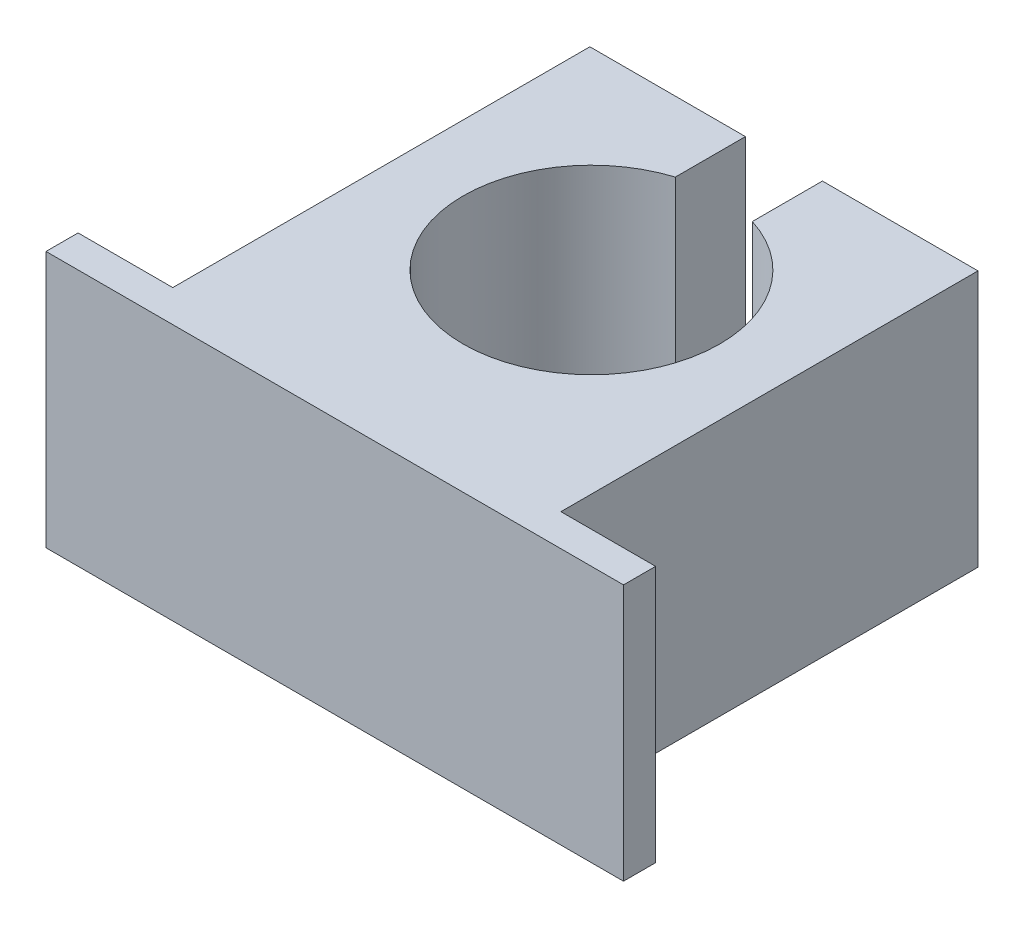
ISO-10303-21;
HEADER;
FILE_DESCRIPTION(('STEP AP214'),'2;1');
FILE_NAME('part.step','',(''),(''),'','','');
FILE_SCHEMA(('AUTOMOTIVE_DESIGN { 1 0 10303 214 1 1 1 1 }'));
ENDSEC;
DATA;
#1=APPLICATION_CONTEXT('core data for automotive mechanical design processes');
#2=APPLICATION_PROTOCOL_DEFINITION('international standard','automotive_design',2000,#1);
#3=PRODUCT_CONTEXT('',#1,'mechanical');
#4=PRODUCT('Part','Part','',(#3));
#5=PRODUCT_RELATED_PRODUCT_CATEGORY('part','',(#4));
#6=PRODUCT_DEFINITION_FORMATION('','',#4);
#7=PRODUCT_DEFINITION_CONTEXT('part definition',#1,'design');
#8=PRODUCT_DEFINITION('design','',#6,#7);
#9=PRODUCT_DEFINITION_SHAPE('','',#8);
#10=(LENGTH_UNIT() NAMED_UNIT(*) SI_UNIT(.MILLI.,.METRE.));
#11=(NAMED_UNIT(*) PLANE_ANGLE_UNIT() SI_UNIT($,.RADIAN.));
#12=(NAMED_UNIT(*) SI_UNIT($,.STERADIAN.) SOLID_ANGLE_UNIT());
#13=UNCERTAINTY_MEASURE_WITH_UNIT(LENGTH_MEASURE(1.E-05),#10,'distance_accuracy_value','');
#14=(GEOMETRIC_REPRESENTATION_CONTEXT(3) GLOBAL_UNCERTAINTY_ASSIGNED_CONTEXT((#13)) GLOBAL_UNIT_ASSIGNED_CONTEXT((#10,
#11,#12)) REPRESENTATION_CONTEXT('',''));
#15=CARTESIAN_POINT('',(0.,0.,0.));
#16=DIRECTION('',(0.,0.,1.));
#17=DIRECTION('',(1.,0.,0.));
#18=AXIS2_PLACEMENT_3D('',#15,#16,#17);
#19=CARTESIAN_POINT('',(-45.,40.,-35.));
#20=DIRECTION('',(0.,0.,1.));
#21=DIRECTION('',(1.,0.,0.));
#22=AXIS2_PLACEMENT_3D('',#19,#20,#21);
#23=PLANE('',#22);
#24=DIRECTION('',(-1.,0.,0.));
#25=VECTOR('',#24,1.);
#26=CARTESIAN_POINT('',(-45.,0.,-35.));
#27=LINE('',#26,#25);
#28=CARTESIAN_POINT('',(30.2446487914628,0.,-35.));
#29=VERTEX_POINT('',#28);
#30=CARTESIAN_POINT('',(6.,0.,-35.));
#31=VERTEX_POINT('',#30);
#32=EDGE_CURVE('E176',#29,#31,#27,.T.);
#33=ORIENTED_EDGE('',*,*,#32,.T.);
#34=DIRECTION('',(0.,1.,0.));
#35=VECTOR('',#34,1.);
#36=CARTESIAN_POINT('',(6.,40.,-35.));
#37=LINE('',#36,#35);
#38=CARTESIAN_POINT('',(6.,40.,-35.));
#39=VERTEX_POINT('',#38);
#40=EDGE_CURVE('E247',#31,#39,#37,.T.);
#41=ORIENTED_EDGE('',*,*,#40,.T.);
#42=DIRECTION('',(-1.,0.,0.));
#43=VECTOR('',#42,1.);
#44=CARTESIAN_POINT('',(-45.,40.,-35.));
#45=LINE('',#44,#43);
#46=CARTESIAN_POINT('',(30.2446487914628,40.,-35.));
#47=VERTEX_POINT('',#46);
#48=EDGE_CURVE('E140',#47,#39,#45,.T.);
#49=ORIENTED_EDGE('',*,*,#48,.F.);
#50=DIRECTION('',(0.,1.,0.));
#51=VECTOR('',#50,1.);
#52=CARTESIAN_POINT('',(30.2446487914628,0.,-35.));
#53=LINE('',#52,#51);
#54=EDGE_CURVE('E242',#29,#47,#53,.T.);
#55=ORIENTED_EDGE('',*,*,#54,.F.);
#56=EDGE_LOOP('',(#33,#41,#49,#55));
#57=FACE_BOUND('',#56,.T.);
#58=ADVANCED_FACE('F39',(#57),#23,.F.);
#59=CARTESIAN_POINT('',(45.,40.,-35.));
#60=DIRECTION('',(-1.,0.,0.));
#61=DIRECTION('',(0.,0.,1.));
#62=AXIS2_PLACEMENT_3D('',#59,#60,#61);
#63=PLANE('',#62);
#64=DIRECTION('',(0.,0.,-1.));
#65=VECTOR('',#64,1.);
#66=CARTESIAN_POINT('',(45.,0.,-35.));
#67=LINE('',#66,#65);
#68=CARTESIAN_POINT('',(45.,0.,35.));
#69=VERTEX_POINT('',#68);
#70=CARTESIAN_POINT('',(45.,0.,30.));
#71=VERTEX_POINT('',#70);
#72=EDGE_CURVE('E150',#69,#71,#67,.T.);
#73=ORIENTED_EDGE('',*,*,#72,.T.);
#74=DIRECTION('',(0.,1.,0.));
#75=VECTOR('',#74,1.);
#76=CARTESIAN_POINT('',(45.,0.,30.));
#77=LINE('',#76,#75);
#78=CARTESIAN_POINT('',(45.,40.,30.));
#79=VERTEX_POINT('',#78);
#80=EDGE_CURVE('E228',#71,#79,#77,.T.);
#81=ORIENTED_EDGE('',*,*,#80,.T.);
#82=DIRECTION('',(0.,0.,-1.));
#83=VECTOR('',#82,1.);
#84=CARTESIAN_POINT('',(45.,40.,-35.));
#85=LINE('',#84,#83);
#86=CARTESIAN_POINT('',(45.,40.,35.));
#87=VERTEX_POINT('',#86);
#88=EDGE_CURVE('E157',#87,#79,#85,.T.);
#89=ORIENTED_EDGE('',*,*,#88,.F.);
#90=DIRECTION('',(0.,-1.,0.));
#91=VECTOR('',#90,1.);
#92=CARTESIAN_POINT('',(45.,40.,35.));
#93=LINE('',#92,#91);
#94=EDGE_CURVE('E171',#87,#69,#93,.T.);
#95=ORIENTED_EDGE('',*,*,#94,.T.);
#96=EDGE_LOOP('',(#73,#81,#89,#95));
#97=FACE_BOUND('',#96,.T.);
#98=ADVANCED_FACE('F41',(#97),#63,.F.);
#99=CARTESIAN_POINT('',(-6.,40.,-35.));
#100=VERTEX_POINT('',#99);
#101=CARTESIAN_POINT('',(-30.2446487914628,40.,-35.));
#102=VERTEX_POINT('',#101);
#103=EDGE_CURVE('E161',#100,#102,#45,.T.);
#104=ORIENTED_EDGE('',*,*,#103,.F.);
#105=DIRECTION('',(0.,-1.,0.));
#106=VECTOR('',#105,1.);
#107=CARTESIAN_POINT('',(-6.,40.,-35.));
#108=LINE('',#107,#106);
#109=CARTESIAN_POINT('',(-6.,0.,-35.));
#110=VERTEX_POINT('',#109);
#111=EDGE_CURVE('E200',#100,#110,#108,.T.);
#112=ORIENTED_EDGE('',*,*,#111,.T.);
#113=CARTESIAN_POINT('',(-30.2446487914628,0.,-35.));
#114=VERTEX_POINT('',#113);
#115=EDGE_CURVE('E175',#110,#114,#27,.T.);
#116=ORIENTED_EDGE('',*,*,#115,.T.);
#117=DIRECTION('',(0.,1.,0.));
#118=VECTOR('',#117,1.);
#119=CARTESIAN_POINT('',(-30.2446487914628,0.,-35.));
#120=LINE('',#119,#118);
#121=EDGE_CURVE('E146',#114,#102,#120,.T.);
#122=ORIENTED_EDGE('',*,*,#121,.T.);
#123=EDGE_LOOP('',(#104,#112,#116,#122));
#124=FACE_BOUND('',#123,.T.);
#125=ADVANCED_FACE('F199',(#124),#23,.F.);
#126=CARTESIAN_POINT('',(-45.,40.,-35.));
#127=DIRECTION('',(1.,0.,0.));
#128=DIRECTION('',(0.,0.,-1.));
#129=AXIS2_PLACEMENT_3D('',#126,#127,#128);
#130=PLANE('',#129);
#131=DIRECTION('',(0.,0.,1.));
#132=VECTOR('',#131,1.);
#133=CARTESIAN_POINT('',(-45.,40.,-35.));
#134=LINE('',#133,#132);
#135=CARTESIAN_POINT('',(-45.,40.,30.));
#136=VERTEX_POINT('',#135);
#137=CARTESIAN_POINT('',(-45.,40.,35.));
#138=VERTEX_POINT('',#137);
#139=EDGE_CURVE('E165',#136,#138,#134,.T.);
#140=ORIENTED_EDGE('',*,*,#139,.F.);
#141=DIRECTION('',(0.,1.,0.));
#142=VECTOR('',#141,1.);
#143=CARTESIAN_POINT('',(-45.,0.,30.));
#144=LINE('',#143,#142);
#145=CARTESIAN_POINT('',(-45.,0.,30.));
#146=VERTEX_POINT('',#145);
#147=EDGE_CURVE('E216',#146,#136,#144,.T.);
#148=ORIENTED_EDGE('',*,*,#147,.F.);
#149=DIRECTION('',(0.,0.,1.));
#150=VECTOR('',#149,1.);
#151=CARTESIAN_POINT('',(-45.,0.,-35.));
#152=LINE('',#151,#150);
#153=CARTESIAN_POINT('',(-45.,0.,35.));
#154=VERTEX_POINT('',#153);
#155=EDGE_CURVE('E180',#146,#154,#152,.T.);
#156=ORIENTED_EDGE('',*,*,#155,.T.);
#157=DIRECTION('',(0.,-1.,0.));
#158=VECTOR('',#157,1.);
#159=CARTESIAN_POINT('',(-45.,40.,35.));
#160=LINE('',#159,#158);
#161=EDGE_CURVE('E188',#138,#154,#160,.T.);
#162=ORIENTED_EDGE('',*,*,#161,.F.);
#163=EDGE_LOOP('',(#140,#148,#156,#162));
#164=FACE_BOUND('',#163,.T.);
#165=ADVANCED_FACE('F280',(#164),#130,.F.);
#166=CARTESIAN_POINT('',(-45.,40.,35.));
#167=DIRECTION('',(0.,0.,-1.));
#168=DIRECTION('',(-1.,0.,0.));
#169=AXIS2_PLACEMENT_3D('',#166,#167,#168);
#170=PLANE('',#169);
#171=DIRECTION('',(1.,0.,0.));
#172=VECTOR('',#171,1.);
#173=CARTESIAN_POINT('',(-45.,0.,35.));
#174=LINE('',#173,#172);
#175=EDGE_CURVE('E162',#154,#69,#174,.T.);
#176=ORIENTED_EDGE('',*,*,#175,.T.);
#177=ORIENTED_EDGE('',*,*,#94,.F.);
#178=DIRECTION('',(1.,0.,0.));
#179=VECTOR('',#178,1.);
#180=CARTESIAN_POINT('',(-45.,40.,35.));
#181=LINE('',#180,#179);
#182=EDGE_CURVE('E168',#138,#87,#181,.T.);
#183=ORIENTED_EDGE('',*,*,#182,.F.);
#184=ORIENTED_EDGE('',*,*,#161,.T.);
#185=EDGE_LOOP('',(#176,#177,#183,#184));
#186=FACE_BOUND('',#185,.T.);
#187=ADVANCED_FACE('F285',(#186),#170,.F.);
#188=CARTESIAN_POINT('',(0.,40.,0.));
#189=DIRECTION('',(0.,1.,0.));
#190=DIRECTION('',(0.,0.,1.));
#191=AXIS2_PLACEMENT_3D('',#188,#189,#190);
#192=PLANE('',#191);
#193=DIRECTION('',(0.,0.,-1.));
#194=VECTOR('',#193,1.);
#195=CARTESIAN_POINT('',(6.,40.,-48.5116266802438));
#196=LINE('',#195,#194);
#197=CARTESIAN_POINT('',(6.,40.,-24.0787840283389));
#198=VERTEX_POINT('',#197);
#199=EDGE_CURVE('E127',#198,#39,#196,.T.);
#200=ORIENTED_EDGE('',*,*,#199,.F.);
#201=CARTESIAN_POINT('',(0.,40.,-5.));
#202=DIRECTION('',(0.,1.,0.));
#203=DIRECTION('',(0.,0.,1.));
#204=AXIS2_PLACEMENT_3D('',#201,#202,#203);
#205=CIRCLE('',#204,20.);
#206=CARTESIAN_POINT('',(-6.,40.,-24.0787840283389));
#207=VERTEX_POINT('',#206);
#208=EDGE_CURVE('E137',#207,#198,#205,.T.);
#209=ORIENTED_EDGE('',*,*,#208,.F.);
#210=DIRECTION('',(0.,0.,1.));
#211=VECTOR('',#210,1.);
#212=CARTESIAN_POINT('',(-6.,40.,-48.5116266802438));
#213=LINE('',#212,#211);
#214=EDGE_CURVE('E55',#100,#207,#213,.T.);
#215=ORIENTED_EDGE('',*,*,#214,.F.);
#216=ORIENTED_EDGE('',*,*,#103,.T.);
#217=DIRECTION('',(0.,0.,-1.));
#218=VECTOR('',#217,1.);
#219=CARTESIAN_POINT('',(-30.2446487914628,40.,-35.));
#220=LINE('',#219,#218);
#221=CARTESIAN_POINT('',(-30.2446487914628,40.,30.));
#222=VERTEX_POINT('',#221);
#223=EDGE_CURVE('E210',#222,#102,#220,.T.);
#224=ORIENTED_EDGE('',*,*,#223,.F.);
#225=DIRECTION('',(1.,0.,0.));
#226=VECTOR('',#225,1.);
#227=CARTESIAN_POINT('',(-45.,40.,30.));
#228=LINE('',#227,#226);
#229=EDGE_CURVE('E224',#136,#222,#228,.T.);
#230=ORIENTED_EDGE('',*,*,#229,.F.);
#231=ORIENTED_EDGE('',*,*,#139,.T.);
#232=ORIENTED_EDGE('',*,*,#182,.T.);
#233=ORIENTED_EDGE('',*,*,#88,.T.);
#234=DIRECTION('',(1.,0.,0.));
#235=VECTOR('',#234,1.);
#236=CARTESIAN_POINT('',(45.,40.,30.));
#237=LINE('',#236,#235);
#238=CARTESIAN_POINT('',(30.2446487914628,40.,30.));
#239=VERTEX_POINT('',#238);
#240=EDGE_CURVE('E238',#239,#79,#237,.T.);
#241=ORIENTED_EDGE('',*,*,#240,.F.);
#242=DIRECTION('',(0.,0.,1.));
#243=VECTOR('',#242,1.);
#244=CARTESIAN_POINT('',(30.2446487914628,40.,-35.));
#245=LINE('',#244,#243);
#246=EDGE_CURVE('E243',#47,#239,#245,.T.);
#247=ORIENTED_EDGE('',*,*,#246,.F.);
#248=ORIENTED_EDGE('',*,*,#48,.T.);
#249=EDGE_LOOP('',(#200,#209,#215,#216,#224,#230,#231,#232,#233,#241,#247,#248));
#250=FACE_BOUND('',#249,.T.);
#251=ADVANCED_FACE('F136',(#250),#192,.T.);
#252=CARTESIAN_POINT('',(0.,0.,0.));
#253=DIRECTION('',(0.,1.,0.));
#254=DIRECTION('',(0.,0.,1.));
#255=AXIS2_PLACEMENT_3D('',#252,#253,#254);
#256=PLANE('',#255);
#257=CARTESIAN_POINT('',(0.,0.,-5.));
#258=DIRECTION('',(0.,1.,0.));
#259=DIRECTION('',(0.,0.,1.));
#260=AXIS2_PLACEMENT_3D('',#257,#258,#259);
#261=CIRCLE('',#260,20.);
#262=CARTESIAN_POINT('',(-6.,0.,-24.0787840283389));
#263=VERTEX_POINT('',#262);
#264=CARTESIAN_POINT('',(6.,0.,-24.0787840283389));
#265=VERTEX_POINT('',#264);
#266=EDGE_CURVE('E145',#263,#265,#261,.T.);
#267=ORIENTED_EDGE('',*,*,#266,.T.);
#268=DIRECTION('',(0.,0.,-1.));
#269=VECTOR('',#268,1.);
#270=CARTESIAN_POINT('',(6.,0.,-48.5116266802438));
#271=LINE('',#270,#269);
#272=EDGE_CURVE('E63',#265,#31,#271,.T.);
#273=ORIENTED_EDGE('',*,*,#272,.T.);
#274=ORIENTED_EDGE('',*,*,#32,.F.);
#275=DIRECTION('',(0.,0.,1.));
#276=VECTOR('',#275,1.);
#277=CARTESIAN_POINT('',(30.2446487914628,0.,-35.));
#278=LINE('',#277,#276);
#279=CARTESIAN_POINT('',(30.2446487914628,0.,30.));
#280=VERTEX_POINT('',#279);
#281=EDGE_CURVE('E233',#29,#280,#278,.T.);
#282=ORIENTED_EDGE('',*,*,#281,.T.);
#283=DIRECTION('',(1.,0.,0.));
#284=VECTOR('',#283,1.);
#285=CARTESIAN_POINT('',(45.,0.,30.));
#286=LINE('',#285,#284);
#287=EDGE_CURVE('E237',#280,#71,#286,.T.);
#288=ORIENTED_EDGE('',*,*,#287,.T.);
#289=ORIENTED_EDGE('',*,*,#72,.F.);
#290=ORIENTED_EDGE('',*,*,#175,.F.);
#291=ORIENTED_EDGE('',*,*,#155,.F.);
#292=DIRECTION('',(1.,0.,0.));
#293=VECTOR('',#292,1.);
#294=CARTESIAN_POINT('',(-45.,0.,30.));
#295=LINE('',#294,#293);
#296=CARTESIAN_POINT('',(-30.2446487914628,0.,30.));
#297=VERTEX_POINT('',#296);
#298=EDGE_CURVE('E214',#146,#297,#295,.T.);
#299=ORIENTED_EDGE('',*,*,#298,.T.);
#300=DIRECTION('',(0.,0.,-1.));
#301=VECTOR('',#300,1.);
#302=CARTESIAN_POINT('',(-30.2446487914628,0.,-35.));
#303=LINE('',#302,#301);
#304=EDGE_CURVE('E207',#297,#114,#303,.T.);
#305=ORIENTED_EDGE('',*,*,#304,.T.);
#306=ORIENTED_EDGE('',*,*,#115,.F.);
#307=DIRECTION('',(0.,0.,1.));
#308=VECTOR('',#307,1.);
#309=CARTESIAN_POINT('',(-6.,0.,-48.5116266802438));
#310=LINE('',#309,#308);
#311=EDGE_CURVE('E265',#110,#263,#310,.T.);
#312=ORIENTED_EDGE('',*,*,#311,.T.);
#313=EDGE_LOOP('',(#267,#273,#274,#282,#288,#289,#290,#291,#299,#305,#306,#312));
#314=FACE_BOUND('',#313,.T.);
#315=ADVANCED_FACE('F212',(#314),#256,.F.);
#316=CARTESIAN_POINT('',(0.,0.,-5.));
#317=DIRECTION('',(0.,1.,0.));
#318=DIRECTION('',(0.,0.,1.));
#319=AXIS2_PLACEMENT_3D('',#316,#317,#318);
#320=CYLINDRICAL_SURFACE('',#319,20.);
#321=ORIENTED_EDGE('',*,*,#208,.T.);
#322=DIRECTION('',(0.,1.,0.));
#323=VECTOR('',#322,1.);
#324=CARTESIAN_POINT('',(6.,0.,-24.0787840283389));
#325=LINE('',#324,#323);
#326=EDGE_CURVE('E11',#198,#265,#325,.F.);
#327=ORIENTED_EDGE('',*,*,#326,.T.);
#328=ORIENTED_EDGE('',*,*,#266,.F.);
#329=DIRECTION('',(0.,1.,0.));
#330=VECTOR('',#329,1.);
#331=CARTESIAN_POINT('',(-6.,0.,-24.0787840283389));
#332=LINE('',#331,#330);
#333=EDGE_CURVE('E48',#263,#207,#332,.T.);
#334=ORIENTED_EDGE('',*,*,#333,.T.);
#335=EDGE_LOOP('',(#321,#327,#328,#334));
#336=FACE_BOUND('',#335,.T.);
#337=ADVANCED_FACE('F143',(#336),#320,.F.);
#338=CARTESIAN_POINT('',(45.,0.,30.));
#339=DIRECTION('',(0.,0.,1.));
#340=DIRECTION('',(1.,0.,0.));
#341=AXIS2_PLACEMENT_3D('',#338,#339,#340);
#342=PLANE('',#341);
#343=ORIENTED_EDGE('',*,*,#240,.T.);
#344=ORIENTED_EDGE('',*,*,#80,.F.);
#345=ORIENTED_EDGE('',*,*,#287,.F.);
#346=DIRECTION('',(0.,1.,0.));
#347=VECTOR('',#346,1.);
#348=CARTESIAN_POINT('',(30.2446487914628,0.,30.));
#349=LINE('',#348,#347);
#350=EDGE_CURVE('E253',#280,#239,#349,.T.);
#351=ORIENTED_EDGE('',*,*,#350,.T.);
#352=EDGE_LOOP('',(#343,#344,#345,#351));
#353=FACE_BOUND('',#352,.T.);
#354=ADVANCED_FACE('F290',(#353),#342,.F.);
#355=CARTESIAN_POINT('',(30.2446487914628,0.,-35.));
#356=DIRECTION('',(-1.,0.,0.));
#357=DIRECTION('',(0.,0.,1.));
#358=AXIS2_PLACEMENT_3D('',#355,#356,#357);
#359=PLANE('',#358);
#360=ORIENTED_EDGE('',*,*,#246,.T.);
#361=ORIENTED_EDGE('',*,*,#350,.F.);
#362=ORIENTED_EDGE('',*,*,#281,.F.);
#363=ORIENTED_EDGE('',*,*,#54,.T.);
#364=EDGE_LOOP('',(#360,#361,#362,#363));
#365=FACE_BOUND('',#364,.T.);
#366=ADVANCED_FACE('F258',(#365),#359,.F.);
#367=CARTESIAN_POINT('',(-30.2446487914628,0.,-35.));
#368=DIRECTION('',(1.,0.,0.));
#369=DIRECTION('',(0.,0.,-1.));
#370=AXIS2_PLACEMENT_3D('',#367,#368,#369);
#371=PLANE('',#370);
#372=ORIENTED_EDGE('',*,*,#223,.T.);
#373=ORIENTED_EDGE('',*,*,#121,.F.);
#374=ORIENTED_EDGE('',*,*,#304,.F.);
#375=DIRECTION('',(0.,1.,0.));
#376=VECTOR('',#375,1.);
#377=CARTESIAN_POINT('',(-30.2446487914628,0.,30.));
#378=LINE('',#377,#376);
#379=EDGE_CURVE('E153',#297,#222,#378,.T.);
#380=ORIENTED_EDGE('',*,*,#379,.T.);
#381=EDGE_LOOP('',(#372,#373,#374,#380));
#382=FACE_BOUND('',#381,.T.);
#383=ADVANCED_FACE('F206',(#382),#371,.F.);
#384=CARTESIAN_POINT('',(-45.,0.,30.));
#385=DIRECTION('',(0.,0.,1.));
#386=DIRECTION('',(1.,0.,0.));
#387=AXIS2_PLACEMENT_3D('',#384,#385,#386);
#388=PLANE('',#387);
#389=ORIENTED_EDGE('',*,*,#229,.T.);
#390=ORIENTED_EDGE('',*,*,#379,.F.);
#391=ORIENTED_EDGE('',*,*,#298,.F.);
#392=ORIENTED_EDGE('',*,*,#147,.T.);
#393=EDGE_LOOP('',(#389,#390,#391,#392));
#394=FACE_BOUND('',#393,.T.);
#395=ADVANCED_FACE('F339',(#394),#388,.F.);
#396=CARTESIAN_POINT('',(-6.,0.,-48.5116266802438));
#397=DIRECTION('',(-1.,0.,0.));
#398=DIRECTION('',(0.,0.,1.));
#399=AXIS2_PLACEMENT_3D('',#396,#397,#398);
#400=PLANE('',#399);
#401=ORIENTED_EDGE('',*,*,#214,.T.);
#402=ORIENTED_EDGE('',*,*,#333,.F.);
#403=ORIENTED_EDGE('',*,*,#311,.F.);
#404=ORIENTED_EDGE('',*,*,#111,.F.);
#405=EDGE_LOOP('',(#401,#402,#403,#404));
#406=FACE_BOUND('',#405,.T.);
#407=ADVANCED_FACE('F273',(#406),#400,.F.);
#408=CARTESIAN_POINT('',(6.,0.,-48.5116266802438));
#409=DIRECTION('',(1.,0.,0.));
#410=DIRECTION('',(0.,0.,-1.));
#411=AXIS2_PLACEMENT_3D('',#408,#409,#410);
#412=PLANE('',#411);
#413=ORIENTED_EDGE('',*,*,#272,.F.);
#414=ORIENTED_EDGE('',*,*,#326,.F.);
#415=ORIENTED_EDGE('',*,*,#199,.T.);
#416=ORIENTED_EDGE('',*,*,#40,.F.);
#417=EDGE_LOOP('',(#413,#414,#415,#416));
#418=FACE_BOUND('',#417,.T.);
#419=ADVANCED_FACE('F126',(#418),#412,.F.);
#420=CLOSED_SHELL('',(#58,#98,#125,#165,#187,#251,#315,#337,#354,#366,#383,#395,#407,#419));
#421=MANIFOLD_SOLID_BREP('B2',#420);
#422=ADVANCED_BREP_SHAPE_REPRESENTATION('',(#18,#421),#14);
#423=SHAPE_DEFINITION_REPRESENTATION(#9,#422);
ENDSEC;
END-ISO-10303-21;
